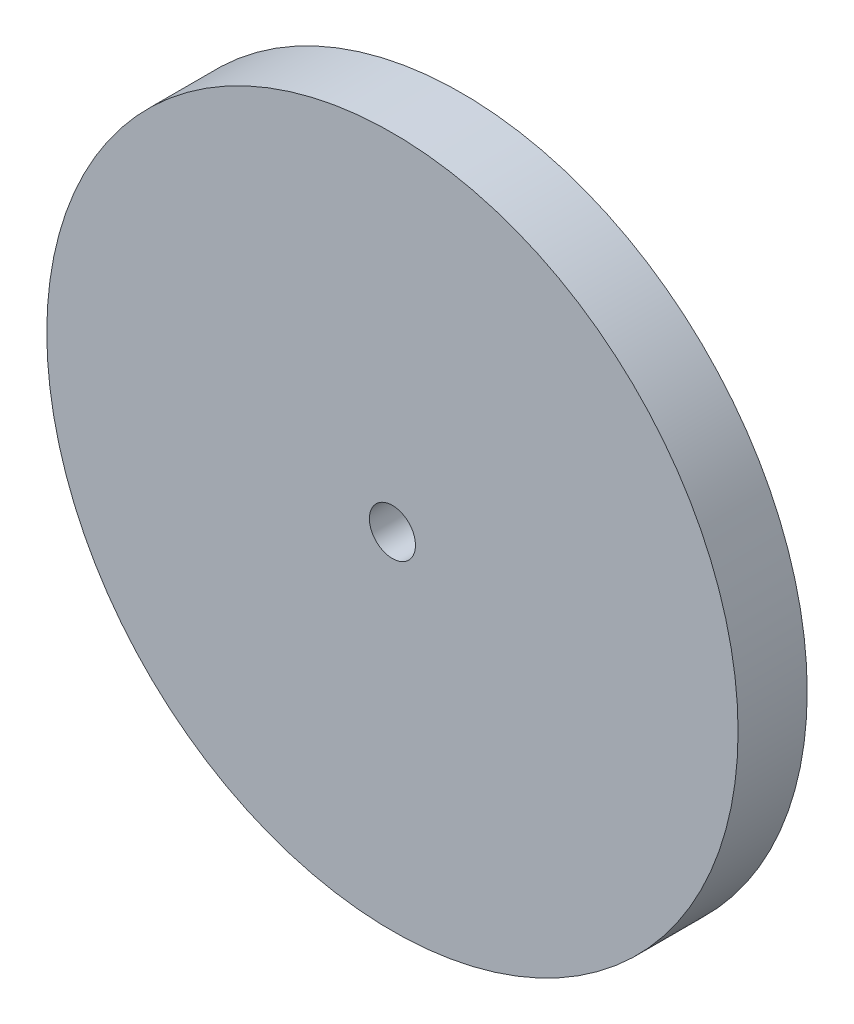
ISO-10303-21;
HEADER;
FILE_DESCRIPTION(('STEP AP214'),'2;1');
FILE_NAME('part.step','',(''),(''),'','','');
FILE_SCHEMA(('AUTOMOTIVE_DESIGN { 1 0 10303 214 1 1 1 1 }'));
ENDSEC;
DATA;
#1=APPLICATION_CONTEXT('core data for automotive mechanical design processes');
#2=APPLICATION_PROTOCOL_DEFINITION('international standard','automotive_design',2000,#1);
#3=PRODUCT_CONTEXT('',#1,'mechanical');
#4=PRODUCT('Part','Part','',(#3));
#5=PRODUCT_RELATED_PRODUCT_CATEGORY('part','',(#4));
#6=PRODUCT_DEFINITION_FORMATION('','',#4);
#7=PRODUCT_DEFINITION_CONTEXT('part definition',#1,'design');
#8=PRODUCT_DEFINITION('design','',#6,#7);
#9=PRODUCT_DEFINITION_SHAPE('','',#8);
#10=(LENGTH_UNIT() NAMED_UNIT(*) SI_UNIT(.MILLI.,.METRE.));
#11=(NAMED_UNIT(*) PLANE_ANGLE_UNIT() SI_UNIT($,.RADIAN.));
#12=(NAMED_UNIT(*) SI_UNIT($,.STERADIAN.) SOLID_ANGLE_UNIT());
#13=UNCERTAINTY_MEASURE_WITH_UNIT(LENGTH_MEASURE(1.E-05),#10,'distance_accuracy_value','');
#14=(GEOMETRIC_REPRESENTATION_CONTEXT(3) GLOBAL_UNCERTAINTY_ASSIGNED_CONTEXT((#13)) GLOBAL_UNIT_ASSIGNED_CONTEXT((#10,
#11,#12)) REPRESENTATION_CONTEXT('',''));
#15=CARTESIAN_POINT('',(0.,0.,0.));
#16=DIRECTION('',(0.,0.,1.));
#17=DIRECTION('',(1.,0.,0.));
#18=AXIS2_PLACEMENT_3D('',#15,#16,#17);
#19=CARTESIAN_POINT('',(0.,0.,152.4));
#20=DIRECTION('',(0.,0.,1.));
#21=DIRECTION('',(1.,0.,0.));
#22=AXIS2_PLACEMENT_3D('',#19,#20,#21);
#23=PLANE('',#22);
#24=CARTESIAN_POINT('',(0.,0.,152.4));
#25=DIRECTION('',(0.,0.,1.));
#26=DIRECTION('',(1.,0.,0.));
#27=AXIS2_PLACEMENT_3D('',#24,#25,#26);
#28=CIRCLE('',#27,762.);
#29=CARTESIAN_POINT('',(-762.,0.,152.4));
#30=VERTEX_POINT('',#29);
#31=EDGE_CURVE('E10',#30,#30,#28,.T.);
#32=ORIENTED_EDGE('',*,*,#31,.T.);
#33=EDGE_LOOP('',(#32));
#34=FACE_BOUND('',#33,.T.);
#35=CARTESIAN_POINT('',(0.,0.,152.4));
#36=DIRECTION('',(0.,0.,1.));
#37=DIRECTION('',(1.,0.,0.));
#38=AXIS2_PLACEMENT_3D('',#35,#36,#37);
#39=CIRCLE('',#38,50.8);
#40=CARTESIAN_POINT('',(-50.8,0.,152.4));
#41=VERTEX_POINT('',#40);
#42=EDGE_CURVE('E45',#41,#41,#39,.T.);
#43=ORIENTED_EDGE('',*,*,#42,.F.);
#44=EDGE_LOOP('',(#43));
#45=FACE_BOUND('',#44,.T.);
#46=ADVANCED_FACE('F34',(#34,#45),#23,.T.);
#47=CARTESIAN_POINT('',(0.,0.,0.));
#48=DIRECTION('',(0.,0.,1.));
#49=DIRECTION('',(1.,0.,0.));
#50=AXIS2_PLACEMENT_3D('',#47,#48,#49);
#51=PLANE('',#50);
#52=CARTESIAN_POINT('',(0.,0.,0.));
#53=DIRECTION('',(0.,0.,1.));
#54=DIRECTION('',(1.,0.,0.));
#55=AXIS2_PLACEMENT_3D('',#52,#53,#54);
#56=CIRCLE('',#55,762.);
#57=CARTESIAN_POINT('',(-762.,0.,0.));
#58=VERTEX_POINT('',#57);
#59=EDGE_CURVE('E38',#58,#58,#56,.T.);
#60=ORIENTED_EDGE('',*,*,#59,.F.);
#61=EDGE_LOOP('',(#60));
#62=FACE_BOUND('',#61,.T.);
#63=CARTESIAN_POINT('',(0.,0.,0.));
#64=DIRECTION('',(0.,0.,1.));
#65=DIRECTION('',(1.,0.,0.));
#66=AXIS2_PLACEMENT_3D('',#63,#64,#65);
#67=CIRCLE('',#66,50.8);
#68=CARTESIAN_POINT('',(-50.8,0.,0.));
#69=VERTEX_POINT('',#68);
#70=EDGE_CURVE('E47',#69,#69,#67,.T.);
#71=ORIENTED_EDGE('',*,*,#70,.T.);
#72=EDGE_LOOP('',(#71));
#73=FACE_BOUND('',#72,.T.);
#74=ADVANCED_FACE('F57',(#62,#73),#51,.F.);
#75=CARTESIAN_POINT('',(0.,0.,152.4));
#76=DIRECTION('',(0.,0.,-1.));
#77=DIRECTION('',(-1.,0.,0.));
#78=AXIS2_PLACEMENT_3D('',#75,#76,#77);
#79=CYLINDRICAL_SURFACE('',#78,762.);
#80=CARTESIAN_POINT('',(-762.,0.,152.4));
#81=CARTESIAN_POINT('',(-762.,0.,150.8125));
#82=CARTESIAN_POINT('',(-762.,0.,149.225));
#83=CARTESIAN_POINT('',(-762.,0.,146.05));
#84=CARTESIAN_POINT('',(-762.,0.,144.4625));
#85=CARTESIAN_POINT('',(-762.,0.,141.2875));
#86=CARTESIAN_POINT('',(-762.,0.,139.7));
#87=CARTESIAN_POINT('',(-762.,0.,136.525));
#88=CARTESIAN_POINT('',(-762.,0.,134.9375));
#89=CARTESIAN_POINT('',(-762.,0.,131.7625));
#90=CARTESIAN_POINT('',(-762.,0.,130.175));
#91=CARTESIAN_POINT('',(-762.,0.,127.));
#92=CARTESIAN_POINT('',(-762.,0.,125.4125));
#93=CARTESIAN_POINT('',(-762.,0.,122.2375));
#94=CARTESIAN_POINT('',(-762.,0.,120.65));
#95=CARTESIAN_POINT('',(-762.,0.,117.475));
#96=CARTESIAN_POINT('',(-762.,0.,115.8875));
#97=CARTESIAN_POINT('',(-762.,0.,112.7125));
#98=CARTESIAN_POINT('',(-762.,0.,111.125));
#99=CARTESIAN_POINT('',(-762.,0.,107.95));
#100=CARTESIAN_POINT('',(-762.,0.,106.3625));
#101=CARTESIAN_POINT('',(-762.,0.,103.1875));
#102=CARTESIAN_POINT('',(-762.,0.,101.6));
#103=CARTESIAN_POINT('',(-762.,0.,98.425));
#104=CARTESIAN_POINT('',(-762.,0.,96.8375));
#105=CARTESIAN_POINT('',(-762.,0.,93.6625));
#106=CARTESIAN_POINT('',(-762.,0.,92.075));
#107=CARTESIAN_POINT('',(-762.,0.,88.9));
#108=CARTESIAN_POINT('',(-762.,0.,87.3125));
#109=CARTESIAN_POINT('',(-762.,0.,84.1375));
#110=CARTESIAN_POINT('',(-762.,0.,82.55));
#111=CARTESIAN_POINT('',(-762.,0.,79.375));
#112=CARTESIAN_POINT('',(-762.,0.,77.7875));
#113=CARTESIAN_POINT('',(-762.,0.,74.6125));
#114=CARTESIAN_POINT('',(-762.,0.,73.025));
#115=CARTESIAN_POINT('',(-762.,0.,69.85));
#116=CARTESIAN_POINT('',(-762.,0.,68.2625));
#117=CARTESIAN_POINT('',(-762.,0.,65.0875));
#118=CARTESIAN_POINT('',(-762.,0.,63.5));
#119=CARTESIAN_POINT('',(-762.,0.,60.325));
#120=CARTESIAN_POINT('',(-762.,0.,58.7375));
#121=CARTESIAN_POINT('',(-762.,0.,55.5625));
#122=CARTESIAN_POINT('',(-762.,0.,53.975));
#123=CARTESIAN_POINT('',(-762.,0.,50.8));
#124=CARTESIAN_POINT('',(-762.,0.,49.2125));
#125=CARTESIAN_POINT('',(-762.,0.,46.0375));
#126=CARTESIAN_POINT('',(-762.,0.,44.45));
#127=CARTESIAN_POINT('',(-762.,0.,41.275));
#128=CARTESIAN_POINT('',(-762.,0.,39.6875));
#129=CARTESIAN_POINT('',(-762.,0.,36.5125));
#130=CARTESIAN_POINT('',(-762.,0.,34.925));
#131=CARTESIAN_POINT('',(-762.,0.,31.75));
#132=CARTESIAN_POINT('',(-762.,0.,30.1625));
#133=CARTESIAN_POINT('',(-762.,0.,26.9875));
#134=CARTESIAN_POINT('',(-762.,0.,25.4));
#135=CARTESIAN_POINT('',(-762.,0.,22.225));
#136=CARTESIAN_POINT('',(-762.,0.,20.6375));
#137=CARTESIAN_POINT('',(-762.,0.,17.4625));
#138=CARTESIAN_POINT('',(-762.,0.,15.875));
#139=CARTESIAN_POINT('',(-762.,0.,12.7));
#140=CARTESIAN_POINT('',(-762.,0.,11.1125));
#141=CARTESIAN_POINT('',(-762.,0.,7.93750000000001));
#142=CARTESIAN_POINT('',(-762.,0.,6.35));
#143=CARTESIAN_POINT('',(-762.,0.,3.175));
#144=CARTESIAN_POINT('',(-762.,0.,1.5875));
#145=CARTESIAN_POINT('',(-762.,0.,0.));
#146=B_SPLINE_CURVE_WITH_KNOTS('',3,(#80,#81,#82,#83,#84,#85,#86,#87,#88,#89,#90,#91,#92,#93,
#94,#95,#96,#97,#98,#99,#100,#101,#102,#103,#104,#105,#106,#107,#108,#109,#110,#111,#112,#113,
#114,#115,#116,#117,#118,#119,#120,#121,#122,#123,#124,#125,#126,#127,#128,#129,#130,#131,#132,
#133,#134,#135,#136,#137,#138,#139,#140,#141,#142,#143,#144,#145),.UNSPECIFIED.,.F.,.F.,(4,2,2,
2,2,2,2,2,2,2,2,2,2,2,2,2,2,2,2,2,2,2,2,2,2,2,2,2,2,2,2,2,4),(0.,4.76249999999998,
9.52499999999998,14.2875,19.05,23.8125,28.575,33.3375,38.1,42.8625,47.625,52.3875,57.15,61.9125,
66.675,71.4375,76.2,80.9625,85.725,90.4875,95.25,100.0125,104.775,109.5375,114.3,119.0625,
123.825,128.5875,133.35,138.1125,142.875,147.6375,152.4),.UNSPECIFIED.);
#147=EDGE_CURVE('BSEAM36',#30,#58,#146,.T.);
#148=ORIENTED_EDGE('',*,*,#31,.F.);
#149=ORIENTED_EDGE('',*,*,#59,.T.);
#150=ORIENTED_EDGE('',*,*,#147,.T.);
#151=ORIENTED_EDGE('',*,*,#147,.F.);
#152=EDGE_LOOP('',(#148,#150,#149,#151));
#153=FACE_BOUND('',#152,.T.);
#154=ADVANCED_FACE('F36',(#153),#79,.T.);
#155=CARTESIAN_POINT('',(0.,0.,152.4));
#156=DIRECTION('',(0.,0.,-1.));
#157=DIRECTION('',(-1.,0.,0.));
#158=AXIS2_PLACEMENT_3D('',#155,#156,#157);
#159=CYLINDRICAL_SURFACE('',#158,50.8);
#160=CARTESIAN_POINT('',(-50.8,0.,152.4));
#161=CARTESIAN_POINT('',(-50.8,0.,150.8125));
#162=CARTESIAN_POINT('',(-50.8,0.,149.225));
#163=CARTESIAN_POINT('',(-50.8,0.,146.05));
#164=CARTESIAN_POINT('',(-50.8,0.,144.4625));
#165=CARTESIAN_POINT('',(-50.8,0.,141.2875));
#166=CARTESIAN_POINT('',(-50.8,0.,139.7));
#167=CARTESIAN_POINT('',(-50.8,0.,136.525));
#168=CARTESIAN_POINT('',(-50.8,0.,134.9375));
#169=CARTESIAN_POINT('',(-50.8,0.,131.7625));
#170=CARTESIAN_POINT('',(-50.8,0.,130.175));
#171=CARTESIAN_POINT('',(-50.8,0.,127.));
#172=CARTESIAN_POINT('',(-50.8,0.,125.4125));
#173=CARTESIAN_POINT('',(-50.8,0.,122.2375));
#174=CARTESIAN_POINT('',(-50.8,0.,120.65));
#175=CARTESIAN_POINT('',(-50.8,0.,117.475));
#176=CARTESIAN_POINT('',(-50.8,0.,115.8875));
#177=CARTESIAN_POINT('',(-50.8,0.,112.7125));
#178=CARTESIAN_POINT('',(-50.8,0.,111.125));
#179=CARTESIAN_POINT('',(-50.8,0.,107.95));
#180=CARTESIAN_POINT('',(-50.8,0.,106.3625));
#181=CARTESIAN_POINT('',(-50.8,0.,103.1875));
#182=CARTESIAN_POINT('',(-50.8,0.,101.6));
#183=CARTESIAN_POINT('',(-50.8,0.,98.425));
#184=CARTESIAN_POINT('',(-50.8,0.,96.8375));
#185=CARTESIAN_POINT('',(-50.8,0.,93.6625));
#186=CARTESIAN_POINT('',(-50.8,0.,92.075));
#187=CARTESIAN_POINT('',(-50.8,0.,88.9));
#188=CARTESIAN_POINT('',(-50.8,0.,87.3125));
#189=CARTESIAN_POINT('',(-50.8,0.,84.1375));
#190=CARTESIAN_POINT('',(-50.8,0.,82.55));
#191=CARTESIAN_POINT('',(-50.8,0.,79.375));
#192=CARTESIAN_POINT('',(-50.8,0.,77.7875));
#193=CARTESIAN_POINT('',(-50.8,0.,74.6125));
#194=CARTESIAN_POINT('',(-50.8,0.,73.025));
#195=CARTESIAN_POINT('',(-50.8,0.,69.85));
#196=CARTESIAN_POINT('',(-50.8,0.,68.2625));
#197=CARTESIAN_POINT('',(-50.8,0.,65.0875));
#198=CARTESIAN_POINT('',(-50.8,0.,63.5));
#199=CARTESIAN_POINT('',(-50.8,0.,60.325));
#200=CARTESIAN_POINT('',(-50.8,0.,58.7375));
#201=CARTESIAN_POINT('',(-50.8,0.,55.5625));
#202=CARTESIAN_POINT('',(-50.8,0.,53.975));
#203=CARTESIAN_POINT('',(-50.8,0.,50.8));
#204=CARTESIAN_POINT('',(-50.8,0.,49.2125));
#205=CARTESIAN_POINT('',(-50.8,0.,46.0375));
#206=CARTESIAN_POINT('',(-50.8,0.,44.45));
#207=CARTESIAN_POINT('',(-50.8,0.,41.275));
#208=CARTESIAN_POINT('',(-50.8,0.,39.6875));
#209=CARTESIAN_POINT('',(-50.8,0.,36.5125));
#210=CARTESIAN_POINT('',(-50.8,0.,34.925));
#211=CARTESIAN_POINT('',(-50.8,0.,31.75));
#212=CARTESIAN_POINT('',(-50.8,0.,30.1625));
#213=CARTESIAN_POINT('',(-50.8,0.,26.9875));
#214=CARTESIAN_POINT('',(-50.8,0.,25.4));
#215=CARTESIAN_POINT('',(-50.8,0.,22.225));
#216=CARTESIAN_POINT('',(-50.8,0.,20.6375));
#217=CARTESIAN_POINT('',(-50.8,0.,17.4625));
#218=CARTESIAN_POINT('',(-50.8,0.,15.875));
#219=CARTESIAN_POINT('',(-50.8,0.,12.7));
#220=CARTESIAN_POINT('',(-50.8,0.,11.1125));
#221=CARTESIAN_POINT('',(-50.8,0.,7.93750000000001));
#222=CARTESIAN_POINT('',(-50.8,0.,6.35));
#223=CARTESIAN_POINT('',(-50.8,0.,3.175));
#224=CARTESIAN_POINT('',(-50.8,0.,1.5875));
#225=CARTESIAN_POINT('',(-50.8,0.,0.));
#226=B_SPLINE_CURVE_WITH_KNOTS('',3,(#160,#161,#162,#163,#164,#165,#166,#167,#168,#169,#170,
#171,#172,#173,#174,#175,#176,#177,#178,#179,#180,#181,#182,#183,#184,#185,#186,#187,#188,#189,
#190,#191,#192,#193,#194,#195,#196,#197,#198,#199,#200,#201,#202,#203,#204,#205,#206,#207,#208,
#209,#210,#211,#212,#213,#214,#215,#216,#217,#218,#219,#220,#221,#222,#223,#224,#225),
.UNSPECIFIED.,.F.,.F.,(4,2,2,2,2,2,2,2,2,2,2,2,2,2,2,2,2,2,2,2,2,2,2,2,2,2,2,2,2,2,2,2,4),(0.,
4.7625,9.52500000000001,14.2875,19.05,23.8125,28.575,33.3375,38.1,42.8625,47.625,52.3875,57.15,
61.9125,66.675,71.4375,76.2,80.9625,85.725,90.4875,95.25,100.0125,104.775,109.5375,114.3,
119.0625,123.825,128.5875,133.35,138.1125,142.875,147.6375,152.4),.UNSPECIFIED.);
#227=EDGE_CURVE('BSEAM53',#41,#69,#226,.T.);
#228=ORIENTED_EDGE('',*,*,#42,.T.);
#229=ORIENTED_EDGE('',*,*,#70,.F.);
#230=ORIENTED_EDGE('',*,*,#227,.T.);
#231=ORIENTED_EDGE('',*,*,#227,.F.);
#232=EDGE_LOOP('',(#228,#230,#229,#231));
#233=FACE_BOUND('',#232,.T.);
#234=ADVANCED_FACE('F53',(#233),#159,.F.);
#235=CLOSED_SHELL('',(#46,#74,#154,#234));
#236=MANIFOLD_SOLID_BREP('B2',#235);
#237=ADVANCED_BREP_SHAPE_REPRESENTATION('',(#18,#236),#14);
#238=SHAPE_DEFINITION_REPRESENTATION(#9,#237);
ENDSEC;
END-ISO-10303-21;
